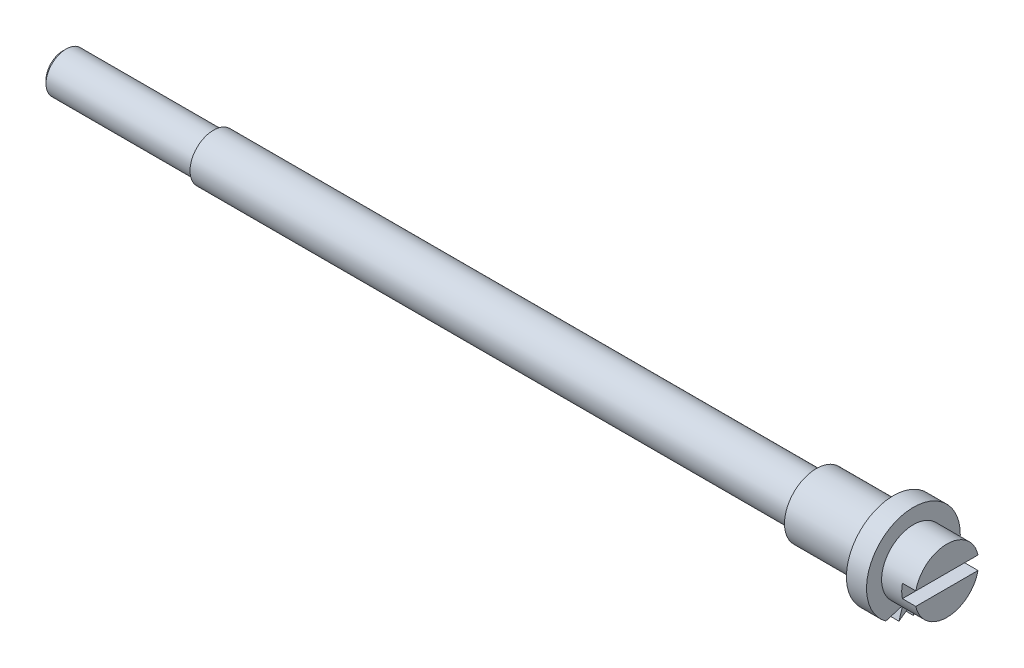
ISO-10303-21;
HEADER;
FILE_DESCRIPTION(('STEP AP214'),'2;1');
FILE_NAME('part.step','',(''),(''),'','','');
FILE_SCHEMA(('AUTOMOTIVE_DESIGN { 1 0 10303 214 1 1 1 1 }'));
ENDSEC;
DATA;
#1=APPLICATION_CONTEXT('core data for automotive mechanical design processes');
#2=APPLICATION_PROTOCOL_DEFINITION('international standard','automotive_design',2000,#1);
#3=PRODUCT_CONTEXT('',#1,'mechanical');
#4=PRODUCT('Part','Part','',(#3));
#5=PRODUCT_RELATED_PRODUCT_CATEGORY('part','',(#4));
#6=PRODUCT_DEFINITION_FORMATION('','',#4);
#7=PRODUCT_DEFINITION_CONTEXT('part definition',#1,'design');
#8=PRODUCT_DEFINITION('design','',#6,#7);
#9=PRODUCT_DEFINITION_SHAPE('','',#8);
#10=(LENGTH_UNIT() NAMED_UNIT(*) SI_UNIT(.MILLI.,.METRE.));
#11=(NAMED_UNIT(*) PLANE_ANGLE_UNIT() SI_UNIT($,.RADIAN.));
#12=(NAMED_UNIT(*) SI_UNIT($,.STERADIAN.) SOLID_ANGLE_UNIT());
#13=UNCERTAINTY_MEASURE_WITH_UNIT(LENGTH_MEASURE(1.E-05),#10,'distance_accuracy_value','');
#14=(GEOMETRIC_REPRESENTATION_CONTEXT(3) GLOBAL_UNCERTAINTY_ASSIGNED_CONTEXT((#13)) GLOBAL_UNIT_ASSIGNED_CONTEXT((#10,
#11,#12)) REPRESENTATION_CONTEXT('',''));
#15=CARTESIAN_POINT('',(0.,0.,0.));
#16=DIRECTION('',(0.,0.,1.));
#17=DIRECTION('',(1.,0.,0.));
#18=AXIS2_PLACEMENT_3D('',#15,#16,#17);
#19=CARTESIAN_POINT('',(-16.,9.5,0.));
#20=DIRECTION('',(-1.,0.,0.));
#21=DIRECTION('',(0.,0.,1.));
#22=AXIS2_PLACEMENT_3D('',#19,#20,#21);
#23=PLANE('',#22);
#24=CARTESIAN_POINT('',(-16.,0.,0.));
#25=DIRECTION('',(1.,0.,0.));
#26=DIRECTION('',(0.,0.,-1.));
#27=AXIS2_PLACEMENT_3D('',#24,#25,#26);
#28=CIRCLE('',#27,9.5);
#29=CARTESIAN_POINT('',(-16.,0.,-9.5));
#30=VERTEX_POINT('',#29);
#31=EDGE_CURVE('E192',#30,#30,#28,.T.);
#32=ORIENTED_EDGE('',*,*,#31,.T.);
#33=EDGE_LOOP('',(#32));
#34=FACE_BOUND('',#33,.T.);
#35=DIRECTION('',(0.,-0.57173324331669,0.820439576377553));
#36=VECTOR('',#35,1.);
#37=CARTESIAN_POINT('',(-16.,-3.82779775003427,-9.28763708296465));
#38=LINE('',#37,#36);
#39=CARTESIAN_POINT('',(-16.,-10.3,0.));
#40=VERTEX_POINT('',#39);
#41=CARTESIAN_POINT('',(-15.9999999999999,-13.3147912281321,4.32623792124927));
#42=VERTEX_POINT('',#41);
#43=EDGE_CURVE('E140',#40,#42,#38,.T.);
#44=ORIENTED_EDGE('',*,*,#43,.T.);
#45=DIRECTION('',(0.,0.951056516295154,-0.309016994374948));
#46=VECTOR('',#45,1.);
#47=CARTESIAN_POINT('',(-16.,8.592830723281,-2.79197994838925));
#48=LINE('',#47,#46);
#49=CARTESIAN_POINT('',(-15.9999999999999,-9.79588211784008,3.18287504206197));
#50=VERTEX_POINT('',#49);
#51=EDGE_CURVE('E131',#42,#50,#48,.T.);
#52=ORIENTED_EDGE('',*,*,#51,.T.);
#53=DIRECTION('',(0.,-0.290220854680453,0.956959693774271));
#54=VECTOR('',#53,1.);
#55=CARTESIAN_POINT('',(-16.,-7.28664696676794,-5.09095112532879));
#56=LINE('',#55,#54);
#57=CARTESIAN_POINT('',(-15.9999999999999,-11.3262379212493,8.22899353209464));
#58=VERTEX_POINT('',#57);
#59=EDGE_CURVE('E123',#50,#58,#56,.T.);
#60=ORIENTED_EDGE('',*,*,#59,.T.);
#61=CARTESIAN_POINT('',(-16.,0.,0.));
#62=DIRECTION('',(1.,0.,0.));
#63=DIRECTION('',(0.,0.,-1.));
#64=AXIS2_PLACEMENT_3D('',#61,#62,#63);
#65=CIRCLE('',#64,14.);
#66=CARTESIAN_POINT('',(-15.9999999999999,-13.3147912281321,-4.32623792124927));
#67=VERTEX_POINT('',#66);
#68=EDGE_CURVE('E190',#67,#58,#65,.T.);
#69=ORIENTED_EDGE('',*,*,#68,.F.);
#70=DIRECTION('',(0.,0.951056516295154,0.309016994374948));
#71=VECTOR('',#70,1.);
#72=CARTESIAN_POINT('',(-16.,8.592830723281,2.79197994838925));
#73=LINE('',#72,#71);
#74=CARTESIAN_POINT('',(-15.9999999999999,-9.79588211784008,-3.18287504206197));
#75=VERTEX_POINT('',#74);
#76=EDGE_CURVE('E150',#67,#75,#73,.T.);
#77=ORIENTED_EDGE('',*,*,#76,.T.);
#78=DIRECTION('',(0.,-0.797280398597347,0.603609116906343));
#79=VECTOR('',#78,1.);
#80=CARTESIAN_POINT('',(-16.,0.937916798707304,-11.3092743571159));
#81=LINE('',#80,#79);
#82=CARTESIAN_POINT('',(-15.9999999999999,-14.,0.));
#83=VERTEX_POINT('',#82);
#84=EDGE_CURVE('E147',#75,#83,#81,.T.);
#85=ORIENTED_EDGE('',*,*,#84,.T.);
#86=DIRECTION('',(0.,1.,0.));
#87=VECTOR('',#86,1.);
#88=CARTESIAN_POINT('',(-16.,9.5,0.));
#89=LINE('',#88,#87);
#90=EDGE_CURVE('E161',#83,#40,#89,.T.);
#91=ORIENTED_EDGE('',*,*,#90,.T.);
#92=EDGE_LOOP('',(#44,#52,#60,#69,#77,#85,#91));
#93=FACE_BOUND('',#92,.T.);
#94=ADVANCED_FACE('F41',(#34,#93),#23,.T.);
#95=CARTESIAN_POINT('',(-10.,14.,0.));
#96=DIRECTION('',(1.,0.,0.));
#97=DIRECTION('',(0.,0.,-1.));
#98=AXIS2_PLACEMENT_3D('',#95,#96,#97);
#99=PLANE('',#98);
#100=CARTESIAN_POINT('',(-10.,0.,0.));
#101=DIRECTION('',(1.,0.,0.));
#102=DIRECTION('',(0.,0.,-1.));
#103=AXIS2_PLACEMENT_3D('',#100,#101,#102);
#104=CIRCLE('',#103,9.5);
#105=CARTESIAN_POINT('',(-10.,0.,-9.5));
#106=VERTEX_POINT('',#105);
#107=EDGE_CURVE('E184',#106,#106,#104,.T.);
#108=ORIENTED_EDGE('',*,*,#107,.F.);
#109=EDGE_LOOP('',(#108));
#110=FACE_BOUND('',#109,.T.);
#111=DIRECTION('',(0.,0.290220854680453,-0.956959693774271));
#112=VECTOR('',#111,1.);
#113=CARTESIAN_POINT('',(-10.,-6.9076203165564,-6.3407345963274));
#114=LINE('',#113,#112);
#115=CARTESIAN_POINT('',(-9.9999999999999,-11.3262379212493,8.22899353209464));
#116=VERTEX_POINT('',#115);
#117=CARTESIAN_POINT('',(-10.,-9.79588211784008,3.18287504206197));
#118=VERTEX_POINT('',#117);
#119=EDGE_CURVE('E50',#116,#118,#114,.T.);
#120=ORIENTED_EDGE('',*,*,#119,.T.);
#121=DIRECTION('',(0.,-0.951056516295154,0.309016994374948));
#122=VECTOR('',#121,1.);
#123=CARTESIAN_POINT('',(-10.,12.6631189606246,-4.11449676604732));
#124=LINE('',#123,#122);
#125=CARTESIAN_POINT('',(-9.9999999999999,-13.3147912281321,4.32623792124927));
#126=VERTEX_POINT('',#125);
#127=EDGE_CURVE('E11',#118,#126,#124,.T.);
#128=ORIENTED_EDGE('',*,*,#127,.T.);
#129=DIRECTION('',(0.,0.57173324331669,-0.820439576377553));
#130=VECTOR('',#129,1.);
#131=CARTESIAN_POINT('',(-10.,-2.35684269322388,-11.3984636927293));
#132=LINE('',#131,#130);
#133=CARTESIAN_POINT('',(-10.,-10.3,0.));
#134=VERTEX_POINT('',#133);
#135=EDGE_CURVE('E221',#126,#134,#132,.T.);
#136=ORIENTED_EDGE('',*,*,#135,.T.);
#137=DIRECTION('',(0.,-1.,0.));
#138=VECTOR('',#137,1.);
#139=CARTESIAN_POINT('',(-10.,14.,0.));
#140=LINE('',#139,#138);
#141=CARTESIAN_POINT('',(-9.9999999999999,-14.,0.));
#142=VERTEX_POINT('',#141);
#143=EDGE_CURVE('E224',#134,#142,#140,.T.);
#144=ORIENTED_EDGE('',*,*,#143,.T.);
#145=DIRECTION('',(0.,0.797280398597347,-0.603609116906343));
#146=VECTOR('',#145,1.);
#147=CARTESIAN_POINT('',(-10.,3.79836895165126,-13.4748800850743));
#148=LINE('',#147,#146);
#149=CARTESIAN_POINT('',(-10.,-9.79588211784008,-3.18287504206197));
#150=VERTEX_POINT('',#149);
#151=EDGE_CURVE('E227',#142,#150,#148,.T.);
#152=ORIENTED_EDGE('',*,*,#151,.T.);
#153=DIRECTION('',(0.,-0.951056516295154,-0.309016994374948));
#154=VECTOR('',#153,1.);
#155=CARTESIAN_POINT('',(-10.,12.6631189606246,4.11449676604732));
#156=LINE('',#155,#154);
#157=CARTESIAN_POINT('',(-9.9999999999999,-13.3147912281321,-4.32623792124927));
#158=VERTEX_POINT('',#157);
#159=EDGE_CURVE('E230',#150,#158,#156,.T.);
#160=ORIENTED_EDGE('',*,*,#159,.T.);
#161=CARTESIAN_POINT('',(-10.,0.,0.));
#162=DIRECTION('',(1.,0.,0.));
#163=DIRECTION('',(0.,0.,-1.));
#164=AXIS2_PLACEMENT_3D('',#161,#162,#163);
#165=CIRCLE('',#164,14.);
#166=EDGE_CURVE('E187',#158,#116,#165,.T.);
#167=ORIENTED_EDGE('',*,*,#166,.T.);
#168=EDGE_LOOP('',(#120,#128,#136,#144,#152,#160,#167));
#169=FACE_BOUND('',#168,.T.);
#170=ADVANCED_FACE('F233',(#110,#169),#99,.T.);
#171=CARTESIAN_POINT('',(0.,0.,0.));
#172=DIRECTION('',(1.,0.,0.));
#173=DIRECTION('',(0.,0.,-1.));
#174=AXIS2_PLACEMENT_3D('',#171,#172,#173);
#175=CYLINDRICAL_SURFACE('',#174,14.);
#176=DIRECTION('',(-1.,0.,0.));
#177=VECTOR('',#176,1.);
#178=CARTESIAN_POINT('',(323.691474269272,-11.3262379212493,8.22899353209464));
#179=LINE('',#178,#177);
#180=EDGE_CURVE('E126',#116,#58,#179,.T.);
#181=ORIENTED_EDGE('',*,*,#180,.F.);
#182=ORIENTED_EDGE('',*,*,#166,.F.);
#183=DIRECTION('',(-1.,0.,0.));
#184=VECTOR('',#183,1.);
#185=CARTESIAN_POINT('',(323.691474269272,-13.3147912281321,-4.32623792124927));
#186=LINE('',#185,#184);
#187=EDGE_CURVE('E142',#158,#67,#186,.T.);
#188=ORIENTED_EDGE('',*,*,#187,.T.);
#189=ORIENTED_EDGE('',*,*,#68,.T.);
#190=EDGE_LOOP('',(#181,#182,#188,#189));
#191=FACE_BOUND('',#190,.T.);
#192=ADVANCED_FACE('F237',(#191),#175,.T.);
#193=CARTESIAN_POINT('',(0.,9.49999999999999,0.));
#194=DIRECTION('',(1.,0.,0.));
#195=DIRECTION('',(0.,0.,-1.));
#196=AXIS2_PLACEMENT_3D('',#193,#194,#195);
#197=PLANE('',#196);
#198=CARTESIAN_POINT('',(0.,0.,0.));
#199=DIRECTION('',(1.,0.,0.));
#200=DIRECTION('',(0.,0.,-1.));
#201=AXIS2_PLACEMENT_3D('',#198,#199,#200);
#202=CIRCLE('',#201,9.49999999999999);
#203=CARTESIAN_POINT('',(0.,2.,-9.28708781050335));
#204=VERTEX_POINT('',#203);
#205=CARTESIAN_POINT('',(0.,2.,9.28708781050335));
#206=VERTEX_POINT('',#205);
#207=EDGE_CURVE('E183',#204,#206,#202,.T.);
#208=ORIENTED_EDGE('',*,*,#207,.T.);
#209=DIRECTION('',(0.,0.,-1.));
#210=VECTOR('',#209,1.);
#211=CARTESIAN_POINT('',(0.,2.,0.));
#212=LINE('',#211,#210);
#213=EDGE_CURVE('E213',#206,#204,#212,.T.);
#214=ORIENTED_EDGE('',*,*,#213,.T.);
#215=EDGE_LOOP('',(#208,#214));
#216=FACE_BOUND('',#215,.T.);
#217=ADVANCED_FACE('F291',(#216),#197,.T.);
#218=CARTESIAN_POINT('',(-264.,0.,0.));
#219=DIRECTION('',(-1.,0.,0.));
#220=DIRECTION('',(0.,0.,1.));
#221=AXIS2_PLACEMENT_3D('',#218,#219,#220);
#222=PLANE('',#221);
#223=CARTESIAN_POINT('',(-264.,0.,0.));
#224=DIRECTION('',(-1.,0.,0.));
#225=DIRECTION('',(0.,0.,1.));
#226=AXIS2_PLACEMENT_3D('',#223,#224,#225);
#227=CIRCLE('',#226,4.99999999999984);
#228=CARTESIAN_POINT('',(-264.,0.,4.99999999999984));
#229=VERTEX_POINT('',#228);
#230=EDGE_CURVE('E210',#229,#229,#227,.T.);
#231=ORIENTED_EDGE('',*,*,#230,.T.);
#232=EDGE_LOOP('',(#231));
#233=FACE_BOUND('',#232,.T.);
#234=ADVANCED_FACE('F288',(#233),#222,.T.);
#235=CARTESIAN_POINT('',(0.,0.,0.));
#236=DIRECTION('',(1.,0.,0.));
#237=DIRECTION('',(0.,0.,-1.));
#238=AXIS2_PLACEMENT_3D('',#235,#236,#237);
#239=CYLINDRICAL_SURFACE('',#238,5.99999999999997);
#240=CARTESIAN_POINT('',(-263.,0.,0.));
#241=DIRECTION('',(-1.,0.,0.));
#242=DIRECTION('',(0.,0.,1.));
#243=AXIS2_PLACEMENT_3D('',#240,#241,#242);
#244=CIRCLE('',#243,5.99999999999997);
#245=CARTESIAN_POINT('',(-263.,0.,5.99999999999997));
#246=VERTEX_POINT('',#245);
#247=EDGE_CURVE('E207',#246,#246,#244,.F.);
#248=ORIENTED_EDGE('',*,*,#247,.T.);
#249=EDGE_LOOP('',(#248));
#250=FACE_BOUND('',#249,.T.);
#251=CARTESIAN_POINT('',(-219.,0.,0.));
#252=DIRECTION('',(1.,0.,0.));
#253=DIRECTION('',(0.,0.,-1.));
#254=AXIS2_PLACEMENT_3D('',#251,#252,#253);
#255=CIRCLE('',#254,5.99999999999997);
#256=CARTESIAN_POINT('',(-219.,0.,-5.99999999999997));
#257=VERTEX_POINT('',#256);
#258=EDGE_CURVE('E204',#257,#257,#255,.T.);
#259=ORIENTED_EDGE('',*,*,#258,.F.);
#260=EDGE_LOOP('',(#259));
#261=FACE_BOUND('',#260,.T.);
#262=ADVANCED_FACE('F285',(#250,#261),#239,.T.);
#263=CARTESIAN_POINT('',(-219.,5.99999999999997,0.));
#264=DIRECTION('',(-1.,0.,0.));
#265=DIRECTION('',(0.,0.,1.));
#266=AXIS2_PLACEMENT_3D('',#263,#264,#265);
#267=PLANE('',#266);
#268=ORIENTED_EDGE('',*,*,#258,.T.);
#269=EDGE_LOOP('',(#268));
#270=FACE_BOUND('',#269,.T.);
#271=CARTESIAN_POINT('',(-219.,0.,0.));
#272=DIRECTION('',(1.,0.,0.));
#273=DIRECTION('',(0.,0.,-1.));
#274=AXIS2_PLACEMENT_3D('',#271,#272,#273);
#275=CIRCLE('',#274,6.99999999999998);
#276=CARTESIAN_POINT('',(-219.,0.,-6.99999999999998));
#277=VERTEX_POINT('',#276);
#278=EDGE_CURVE('E201',#277,#277,#275,.T.);
#279=ORIENTED_EDGE('',*,*,#278,.F.);
#280=EDGE_LOOP('',(#279));
#281=FACE_BOUND('',#280,.T.);
#282=ADVANCED_FACE('F281',(#270,#281),#267,.T.);
#283=CARTESIAN_POINT('',(0.,0.,0.));
#284=DIRECTION('',(1.,0.,0.));
#285=DIRECTION('',(0.,0.,-1.));
#286=AXIS2_PLACEMENT_3D('',#283,#284,#285);
#287=CYLINDRICAL_SURFACE('',#286,6.99999999999998);
#288=ORIENTED_EDGE('',*,*,#278,.T.);
#289=EDGE_LOOP('',(#288));
#290=FACE_BOUND('',#289,.T.);
#291=CARTESIAN_POINT('',(-39.,0.,0.));
#292=DIRECTION('',(1.,0.,0.));
#293=DIRECTION('',(0.,0.,-1.));
#294=AXIS2_PLACEMENT_3D('',#291,#292,#293);
#295=CIRCLE('',#294,6.99999999999998);
#296=CARTESIAN_POINT('',(-39.,0.,-6.99999999999998));
#297=VERTEX_POINT('',#296);
#298=EDGE_CURVE('E198',#297,#297,#295,.T.);
#299=ORIENTED_EDGE('',*,*,#298,.F.);
#300=EDGE_LOOP('',(#299));
#301=FACE_BOUND('',#300,.T.);
#302=ADVANCED_FACE('F277',(#290,#301),#287,.T.);
#303=CARTESIAN_POINT('',(-39.,6.99999999999998,0.));
#304=DIRECTION('',(-1.,0.,0.));
#305=DIRECTION('',(0.,0.,1.));
#306=AXIS2_PLACEMENT_3D('',#303,#304,#305);
#307=PLANE('',#306);
#308=ORIENTED_EDGE('',*,*,#298,.T.);
#309=EDGE_LOOP('',(#308));
#310=FACE_BOUND('',#309,.T.);
#311=CARTESIAN_POINT('',(-39.,0.,0.));
#312=DIRECTION('',(1.,0.,0.));
#313=DIRECTION('',(0.,0.,-1.));
#314=AXIS2_PLACEMENT_3D('',#311,#312,#313);
#315=CIRCLE('',#314,9.5);
#316=CARTESIAN_POINT('',(-39.,0.,-9.5));
#317=VERTEX_POINT('',#316);
#318=EDGE_CURVE('E195',#317,#317,#315,.T.);
#319=ORIENTED_EDGE('',*,*,#318,.F.);
#320=EDGE_LOOP('',(#319));
#321=FACE_BOUND('',#320,.T.);
#322=ADVANCED_FACE('F273',(#310,#321),#307,.T.);
#323=CARTESIAN_POINT('',(0.,0.,0.));
#324=DIRECTION('',(1.,0.,0.));
#325=DIRECTION('',(0.,0.,-1.));
#326=AXIS2_PLACEMENT_3D('',#323,#324,#325);
#327=CYLINDRICAL_SURFACE('',#326,9.5);
#328=ORIENTED_EDGE('',*,*,#318,.T.);
#329=EDGE_LOOP('',(#328));
#330=FACE_BOUND('',#329,.T.);
#331=ORIENTED_EDGE('',*,*,#31,.F.);
#332=EDGE_LOOP('',(#331));
#333=FACE_BOUND('',#332,.T.);
#334=ADVANCED_FACE('F269',(#330,#333),#327,.T.);
#335=CARTESIAN_POINT('',(0.,0.,0.));
#336=DIRECTION('',(1.,0.,0.));
#337=DIRECTION('',(0.,0.,-1.));
#338=AXIS2_PLACEMENT_3D('',#335,#336,#337);
#339=CYLINDRICAL_SURFACE('',#338,9.5);
#340=DIRECTION('',(1.,0.,0.));
#341=VECTOR('',#340,1.);
#342=CARTESIAN_POINT('',(0.,-2.,-9.28708781050335));
#343=LINE('',#342,#341);
#344=CARTESIAN_POINT('',(0.,-2.,-9.28708781050335));
#345=VERTEX_POINT('',#344);
#346=CARTESIAN_POINT('',(-4.,-2.,-9.28708781050335));
#347=VERTEX_POINT('',#346);
#348=EDGE_CURVE('E177',#345,#347,#343,.F.);
#349=ORIENTED_EDGE('',*,*,#348,.F.);
#350=CARTESIAN_POINT('',(0.,-2.,9.28708781050335));
#351=VERTEX_POINT('',#350);
#352=EDGE_CURVE('E180',#351,#345,#202,.T.);
#353=ORIENTED_EDGE('',*,*,#352,.F.);
#354=DIRECTION('',(1.,0.,0.));
#355=VECTOR('',#354,1.);
#356=CARTESIAN_POINT('',(0.,-2.,9.28708781050335));
#357=LINE('',#356,#355);
#358=CARTESIAN_POINT('',(-4.,-2.,9.28708781050335));
#359=VERTEX_POINT('',#358);
#360=EDGE_CURVE('E175',#359,#351,#357,.T.);
#361=ORIENTED_EDGE('',*,*,#360,.F.);
#362=CARTESIAN_POINT('',(-4.,0.,0.));
#363=DIRECTION('',(-1.,0.,0.));
#364=DIRECTION('',(0.,0.,1.));
#365=AXIS2_PLACEMENT_3D('',#362,#363,#364);
#366=CIRCLE('',#365,9.5);
#367=CARTESIAN_POINT('',(-4.,2.,9.28708781050335));
#368=VERTEX_POINT('',#367);
#369=EDGE_CURVE('E218',#368,#359,#366,.F.);
#370=ORIENTED_EDGE('',*,*,#369,.F.);
#371=DIRECTION('',(1.,0.,0.));
#372=VECTOR('',#371,1.);
#373=CARTESIAN_POINT('',(0.,2.,9.28708781050335));
#374=LINE('',#373,#372);
#375=EDGE_CURVE('E169',#368,#206,#374,.T.);
#376=ORIENTED_EDGE('',*,*,#375,.T.);
#377=ORIENTED_EDGE('',*,*,#207,.F.);
#378=DIRECTION('',(1.,0.,0.));
#379=VECTOR('',#378,1.);
#380=CARTESIAN_POINT('',(0.,2.,-9.28708781050335));
#381=LINE('',#380,#379);
#382=CARTESIAN_POINT('',(-4.,2.,-9.28708781050335));
#383=VERTEX_POINT('',#382);
#384=EDGE_CURVE('E172',#204,#383,#381,.F.);
#385=ORIENTED_EDGE('',*,*,#384,.T.);
#386=EDGE_CURVE('E220',#347,#383,#366,.F.);
#387=ORIENTED_EDGE('',*,*,#386,.F.);
#388=EDGE_LOOP('',(#349,#353,#361,#370,#376,#377,#385,#387));
#389=FACE_BOUND('',#388,.T.);
#390=ORIENTED_EDGE('',*,*,#107,.T.);
#391=EDGE_LOOP('',(#390));
#392=FACE_BOUND('',#391,.T.);
#393=ADVANCED_FACE('F272',(#389,#392),#339,.T.);
#394=DIRECTION('',(0.,0.,-1.));
#395=VECTOR('',#394,1.);
#396=CARTESIAN_POINT('',(0.,-2.,0.));
#397=LINE('',#396,#395);
#398=EDGE_CURVE('E216',#351,#345,#397,.T.);
#399=ORIENTED_EDGE('',*,*,#398,.F.);
#400=ORIENTED_EDGE('',*,*,#352,.T.);
#401=EDGE_LOOP('',(#399,#400));
#402=FACE_BOUND('',#401,.T.);
#403=ADVANCED_FACE('F298',(#402),#197,.T.);
#404=CARTESIAN_POINT('',(-263.,0.,0.));
#405=DIRECTION('',(1.,0.,0.));
#406=DIRECTION('',(0.,0.,-1.));
#407=AXIS2_PLACEMENT_3D('',#404,#405,#406);
#408=CONICAL_SURFACE('',#407,5.99999999999997,0.785398163397457);
#409=ORIENTED_EDGE('',*,*,#230,.F.);
#410=EDGE_LOOP('',(#409));
#411=FACE_BOUND('',#410,.T.);
#412=ORIENTED_EDGE('',*,*,#247,.F.);
#413=EDGE_LOOP('',(#412));
#414=FACE_BOUND('',#413,.T.);
#415=ADVANCED_FACE('F44',(#411,#414),#408,.T.);
#416=CARTESIAN_POINT('',(-4.,-2.,9.49999999999999));
#417=DIRECTION('',(0.,-1.,0.));
#418=DIRECTION('',(0.,0.,-1.));
#419=AXIS2_PLACEMENT_3D('',#416,#417,#418);
#420=PLANE('',#419);
#421=ORIENTED_EDGE('',*,*,#348,.T.);
#422=DIRECTION('',(0.,0.,-1.));
#423=VECTOR('',#422,1.);
#424=CARTESIAN_POINT('',(-4.,-2.,9.49999999999999));
#425=LINE('',#424,#423);
#426=EDGE_CURVE('E163',#359,#347,#425,.T.);
#427=ORIENTED_EDGE('',*,*,#426,.F.);
#428=ORIENTED_EDGE('',*,*,#360,.T.);
#429=ORIENTED_EDGE('',*,*,#398,.T.);
#430=EDGE_LOOP('',(#421,#427,#428,#429));
#431=FACE_BOUND('',#430,.T.);
#432=ADVANCED_FACE('F303',(#431),#420,.F.);
#433=CARTESIAN_POINT('',(-4.,2.,9.49999999999999));
#434=DIRECTION('',(0.,-1.,0.));
#435=DIRECTION('',(0.,0.,-1.));
#436=AXIS2_PLACEMENT_3D('',#433,#434,#435);
#437=PLANE('',#436);
#438=ORIENTED_EDGE('',*,*,#213,.F.);
#439=ORIENTED_EDGE('',*,*,#375,.F.);
#440=DIRECTION('',(0.,0.,-1.));
#441=VECTOR('',#440,1.);
#442=CARTESIAN_POINT('',(-4.,2.,9.49999999999999));
#443=LINE('',#442,#441);
#444=EDGE_CURVE('E166',#368,#383,#443,.T.);
#445=ORIENTED_EDGE('',*,*,#444,.T.);
#446=ORIENTED_EDGE('',*,*,#384,.F.);
#447=EDGE_LOOP('',(#438,#439,#445,#446));
#448=FACE_BOUND('',#447,.T.);
#449=ADVANCED_FACE('F318',(#448),#437,.T.);
#450=CARTESIAN_POINT('',(-4.,0.,0.));
#451=DIRECTION('',(-1.,0.,0.));
#452=DIRECTION('',(0.,0.,1.));
#453=AXIS2_PLACEMENT_3D('',#450,#451,#452);
#454=PLANE('',#453);
#455=ORIENTED_EDGE('',*,*,#426,.T.);
#456=ORIENTED_EDGE('',*,*,#386,.T.);
#457=ORIENTED_EDGE('',*,*,#444,.F.);
#458=ORIENTED_EDGE('',*,*,#369,.T.);
#459=EDGE_LOOP('',(#455,#456,#457,#458));
#460=FACE_BOUND('',#459,.T.);
#461=ADVANCED_FACE('F256',(#460),#454,.F.);
#462=CARTESIAN_POINT('',(336.191474269272,-14.,0.));
#463=DIRECTION('',(0.,0.,1.));
#464=DIRECTION('',(1.,0.,0.));
#465=AXIS2_PLACEMENT_3D('',#462,#463,#464);
#466=PLANE('',#465);
#467=ORIENTED_EDGE('',*,*,#90,.F.);
#468=DIRECTION('',(-1.,0.,0.));
#469=VECTOR('',#468,1.);
#470=CARTESIAN_POINT('',(336.191474269272,-14.,0.));
#471=LINE('',#470,#469);
#472=EDGE_CURVE('E156',#142,#83,#471,.T.);
#473=ORIENTED_EDGE('',*,*,#472,.F.);
#474=ORIENTED_EDGE('',*,*,#143,.F.);
#475=DIRECTION('',(-1.,0.,0.));
#476=VECTOR('',#475,1.);
#477=CARTESIAN_POINT('',(336.191474269272,-10.3,0.));
#478=LINE('',#477,#476);
#479=EDGE_CURVE('E153',#134,#40,#478,.T.);
#480=ORIENTED_EDGE('',*,*,#479,.T.);
#481=EDGE_LOOP('',(#467,#473,#474,#480));
#482=FACE_BOUND('',#481,.T.);
#483=ADVANCED_FACE('F246',(#482),#466,.T.);
#484=CARTESIAN_POINT('',(336.191474269272,-10.3,0.));
#485=DIRECTION('',(0.,-0.820439576377553,-0.57173324331669));
#486=DIRECTION('',(0.,0.57173324331669,-0.820439576377553));
#487=AXIS2_PLACEMENT_3D('',#484,#485,#486);
#488=PLANE('',#487);
#489=ORIENTED_EDGE('',*,*,#43,.F.);
#490=ORIENTED_EDGE('',*,*,#479,.F.);
#491=ORIENTED_EDGE('',*,*,#135,.F.);
#492=DIRECTION('',(-1.,0.,0.));
#493=VECTOR('',#492,1.);
#494=CARTESIAN_POINT('',(336.191474269272,-13.3147912281321,4.32623792124927));
#495=LINE('',#494,#493);
#496=EDGE_CURVE('E154',#126,#42,#495,.T.);
#497=ORIENTED_EDGE('',*,*,#496,.T.);
#498=EDGE_LOOP('',(#489,#490,#491,#497));
#499=FACE_BOUND('',#498,.T.);
#500=ADVANCED_FACE('F248',(#499),#488,.T.);
#501=CARTESIAN_POINT('',(323.691474269272,-13.3147912281321,-4.32623792124927));
#502=DIRECTION('',(0.,-0.309016994374948,0.951056516295153));
#503=DIRECTION('',(0.,-0.951056516295154,-0.309016994374948));
#504=AXIS2_PLACEMENT_3D('',#501,#502,#503);
#505=PLANE('',#504);
#506=ORIENTED_EDGE('',*,*,#76,.F.);
#507=ORIENTED_EDGE('',*,*,#187,.F.);
#508=ORIENTED_EDGE('',*,*,#159,.F.);
#509=DIRECTION('',(-1.,0.,0.));
#510=VECTOR('',#509,1.);
#511=CARTESIAN_POINT('',(323.691474269272,-9.79588211784008,-3.18287504206197));
#512=LINE('',#511,#510);
#513=EDGE_CURVE('E65',#150,#75,#512,.T.);
#514=ORIENTED_EDGE('',*,*,#513,.T.);
#515=EDGE_LOOP('',(#506,#507,#508,#514));
#516=FACE_BOUND('',#515,.T.);
#517=ADVANCED_FACE('F241',(#516),#505,.T.);
#518=CARTESIAN_POINT('',(323.691474269272,-9.79588211784008,-3.18287504206197));
#519=DIRECTION('',(0.,-0.603609116906343,-0.797280398597347));
#520=DIRECTION('',(0.,0.797280398597347,-0.603609116906343));
#521=AXIS2_PLACEMENT_3D('',#518,#519,#520);
#522=PLANE('',#521);
#523=ORIENTED_EDGE('',*,*,#84,.F.);
#524=ORIENTED_EDGE('',*,*,#513,.F.);
#525=ORIENTED_EDGE('',*,*,#151,.F.);
#526=ORIENTED_EDGE('',*,*,#472,.T.);
#527=EDGE_LOOP('',(#523,#524,#525,#526));
#528=FACE_BOUND('',#527,.T.);
#529=ADVANCED_FACE('F244',(#528),#522,.T.);
#530=CARTESIAN_POINT('',(323.691474269272,-13.3147912281321,4.32623792124927));
#531=DIRECTION('',(0.,0.309016994374948,0.951056516295153));
#532=DIRECTION('',(0.,-0.951056516295154,0.309016994374948));
#533=AXIS2_PLACEMENT_3D('',#530,#531,#532);
#534=PLANE('',#533);
#535=ORIENTED_EDGE('',*,*,#51,.F.);
#536=ORIENTED_EDGE('',*,*,#496,.F.);
#537=ORIENTED_EDGE('',*,*,#127,.F.);
#538=DIRECTION('',(-1.,0.,0.));
#539=VECTOR('',#538,1.);
#540=CARTESIAN_POINT('',(323.691474269272,-9.79588211784008,3.18287504206197));
#541=LINE('',#540,#539);
#542=EDGE_CURVE('E57',#118,#50,#541,.T.);
#543=ORIENTED_EDGE('',*,*,#542,.T.);
#544=EDGE_LOOP('',(#535,#536,#537,#543));
#545=FACE_BOUND('',#544,.T.);
#546=ADVANCED_FACE('F134',(#545),#534,.T.);
#547=CARTESIAN_POINT('',(323.691474269272,-9.79588211784008,3.18287504206197));
#548=DIRECTION('',(0.,-0.956959693774271,-0.290220854680453));
#549=DIRECTION('',(0.,0.290220854680453,-0.956959693774271));
#550=AXIS2_PLACEMENT_3D('',#547,#548,#549);
#551=PLANE('',#550);
#552=ORIENTED_EDGE('',*,*,#59,.F.);
#553=ORIENTED_EDGE('',*,*,#542,.F.);
#554=ORIENTED_EDGE('',*,*,#119,.F.);
#555=ORIENTED_EDGE('',*,*,#180,.T.);
#556=EDGE_LOOP('',(#552,#553,#554,#555));
#557=FACE_BOUND('',#556,.T.);
#558=ADVANCED_FACE('F124',(#557),#551,.T.);
#559=CLOSED_SHELL('',(#94,#170,#192,#217,#234,#262,#282,#302,#322,#334,#393,#403,#415,#432,#449,
#461,#483,#500,#517,#529,#546,#558));
#560=MANIFOLD_SOLID_BREP('B2',#559);
#561=ADVANCED_BREP_SHAPE_REPRESENTATION('',(#18,#560),#14);
#562=SHAPE_DEFINITION_REPRESENTATION(#9,#561);
ENDSEC;
END-ISO-10303-21;
